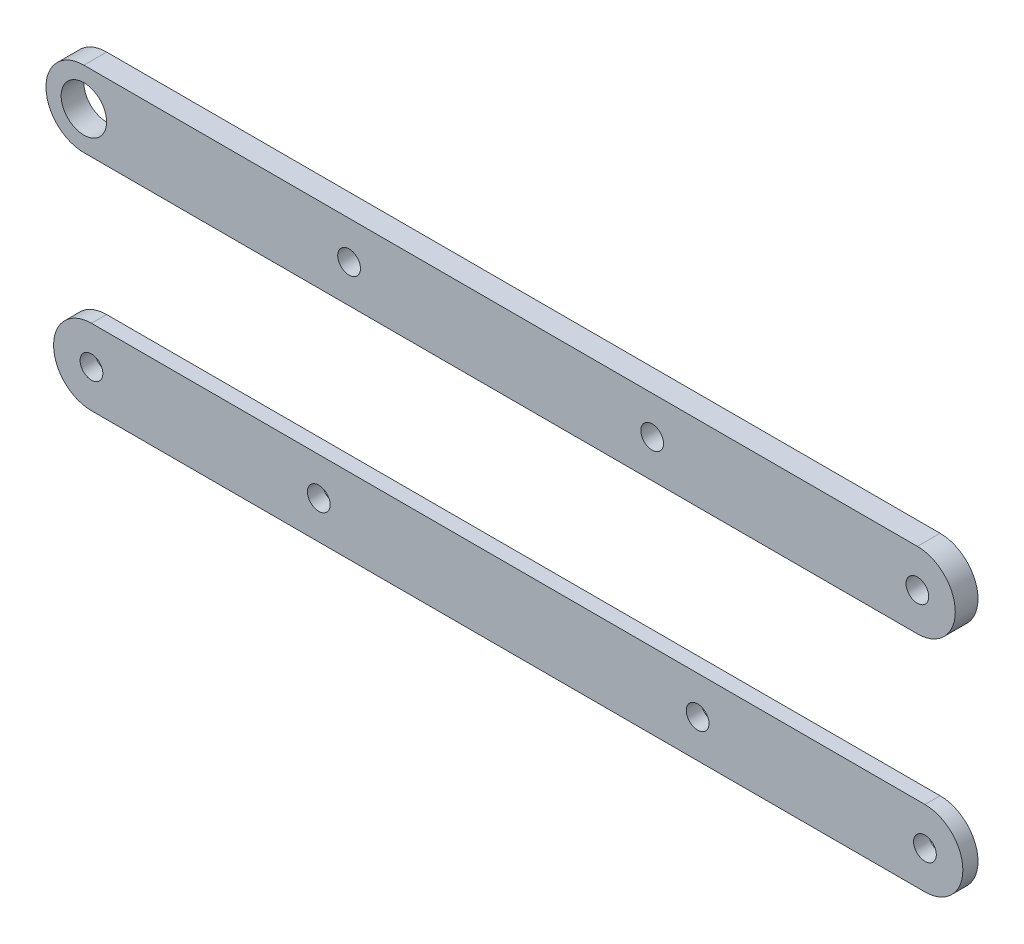
ISO-10303-21;
HEADER;
FILE_DESCRIPTION(('STEP AP214'),'2;1');
FILE_NAME('part.step','',(''),(''),'','','');
FILE_SCHEMA(('AUTOMOTIVE_DESIGN { 1 0 10303 214 1 1 1 1 }'));
ENDSEC;
DATA;
#1=APPLICATION_CONTEXT('core data for automotive mechanical design processes');
#2=APPLICATION_PROTOCOL_DEFINITION('international standard','automotive_design',2000,#1);
#3=PRODUCT_CONTEXT('',#1,'mechanical');
#4=PRODUCT('Part','Part','',(#3));
#5=PRODUCT_RELATED_PRODUCT_CATEGORY('part','',(#4));
#6=PRODUCT_DEFINITION_FORMATION('','',#4);
#7=PRODUCT_DEFINITION_CONTEXT('part definition',#1,'design');
#8=PRODUCT_DEFINITION('design','',#6,#7);
#9=PRODUCT_DEFINITION_SHAPE('','',#8);
#10=(LENGTH_UNIT() NAMED_UNIT(*) SI_UNIT(.MILLI.,.METRE.));
#11=(NAMED_UNIT(*) PLANE_ANGLE_UNIT() SI_UNIT($,.RADIAN.));
#12=(NAMED_UNIT(*) SI_UNIT($,.STERADIAN.) SOLID_ANGLE_UNIT());
#13=UNCERTAINTY_MEASURE_WITH_UNIT(LENGTH_MEASURE(1.E-05),#10,'distance_accuracy_value','');
#14=(GEOMETRIC_REPRESENTATION_CONTEXT(3) GLOBAL_UNCERTAINTY_ASSIGNED_CONTEXT((#13)) GLOBAL_UNIT_ASSIGNED_CONTEXT((#10,
#11,#12)) REPRESENTATION_CONTEXT('',''));
#15=CARTESIAN_POINT('',(0.,0.,0.));
#16=DIRECTION('',(0.,0.,1.));
#17=DIRECTION('',(1.,0.,0.));
#18=AXIS2_PLACEMENT_3D('',#15,#16,#17);
#19=CARTESIAN_POINT('',(-55.,-30.,0.));
#20=DIRECTION('',(0.,0.,1.));
#21=DIRECTION('',(1.,0.,0.));
#22=AXIS2_PLACEMENT_3D('',#19,#20,#21);
#23=CYLINDRICAL_SURFACE('',#22,5.);
#24=CARTESIAN_POINT('',(-55.,-30.,2.));
#25=DIRECTION('',(0.,0.,1.));
#26=DIRECTION('',(1.,0.,0.));
#27=AXIS2_PLACEMENT_3D('',#24,#25,#26);
#28=CIRCLE('',#27,5.);
#29=CARTESIAN_POINT('',(-55.,-25.,2.));
#30=VERTEX_POINT('',#29);
#31=CARTESIAN_POINT('',(-55.,-35.,2.));
#32=VERTEX_POINT('',#31);
#33=EDGE_CURVE('P0_E102',#30,#32,#28,.T.);
#34=ORIENTED_EDGE('',*,*,#33,.F.);
#35=DIRECTION('',(0.,0.,1.));
#36=VECTOR('',#35,1.);
#37=CARTESIAN_POINT('',(-55.,-25.,0.));
#38=LINE('',#37,#36);
#39=CARTESIAN_POINT('',(-55.,-25.,0.));
#40=VERTEX_POINT('',#39);
#41=EDGE_CURVE('P0_E11',#40,#30,#38,.T.);
#42=ORIENTED_EDGE('',*,*,#41,.F.);
#43=CARTESIAN_POINT('',(-55.,-30.,0.));
#44=DIRECTION('',(0.,0.,1.));
#45=DIRECTION('',(1.,0.,0.));
#46=AXIS2_PLACEMENT_3D('',#43,#44,#45);
#47=CIRCLE('',#46,5.);
#48=CARTESIAN_POINT('',(-55.,-35.,0.));
#49=VERTEX_POINT('',#48);
#50=EDGE_CURVE('P0_E95',#40,#49,#47,.T.);
#51=ORIENTED_EDGE('',*,*,#50,.T.);
#52=DIRECTION('',(0.,0.,1.));
#53=VECTOR('',#52,1.);
#54=CARTESIAN_POINT('',(-55.,-35.,0.));
#55=LINE('',#54,#53);
#56=EDGE_CURVE('P0_E40',#49,#32,#55,.T.);
#57=ORIENTED_EDGE('',*,*,#56,.T.);
#58=EDGE_LOOP('',(#34,#42,#51,#57));
#59=FACE_BOUND('',#58,.T.);
#60=ADVANCED_FACE('P0_F37',(#59),#23,.T.);
#61=CARTESIAN_POINT('',(55.,-25.,0.));
#62=DIRECTION('',(0.,1.,0.));
#63=DIRECTION('',(0.,0.,1.));
#64=AXIS2_PLACEMENT_3D('',#61,#62,#63);
#65=PLANE('',#64);
#66=DIRECTION('',(-1.,0.,0.));
#67=VECTOR('',#66,1.);
#68=CARTESIAN_POINT('',(55.,-25.,2.));
#69=LINE('',#68,#67);
#70=CARTESIAN_POINT('',(55.,-25.,2.));
#71=VERTEX_POINT('',#70);
#72=EDGE_CURVE('P0_E97',#71,#30,#69,.T.);
#73=ORIENTED_EDGE('',*,*,#72,.F.);
#74=DIRECTION('',(0.,0.,1.));
#75=VECTOR('',#74,1.);
#76=CARTESIAN_POINT('',(55.,-25.,0.));
#77=LINE('',#76,#75);
#78=CARTESIAN_POINT('',(55.,-25.,0.));
#79=VERTEX_POINT('',#78);
#80=EDGE_CURVE('P0_E46',#79,#71,#77,.T.);
#81=ORIENTED_EDGE('',*,*,#80,.F.);
#82=DIRECTION('',(-1.,0.,0.));
#83=VECTOR('',#82,1.);
#84=CARTESIAN_POINT('',(55.,-25.,0.));
#85=LINE('',#84,#83);
#86=EDGE_CURVE('P0_E92',#79,#40,#85,.T.);
#87=ORIENTED_EDGE('',*,*,#86,.T.);
#88=ORIENTED_EDGE('',*,*,#41,.T.);
#89=EDGE_LOOP('',(#73,#81,#87,#88));
#90=FACE_BOUND('',#89,.T.);
#91=ADVANCED_FACE('P0_F113',(#90),#65,.T.);
#92=CARTESIAN_POINT('',(55.,-30.,0.));
#93=DIRECTION('',(0.,0.,1.));
#94=DIRECTION('',(1.,0.,0.));
#95=AXIS2_PLACEMENT_3D('',#92,#93,#94);
#96=CYLINDRICAL_SURFACE('',#95,5.);
#97=CARTESIAN_POINT('',(55.,-30.,2.));
#98=DIRECTION('',(0.,0.,1.));
#99=DIRECTION('',(1.,0.,0.));
#100=AXIS2_PLACEMENT_3D('',#97,#98,#99);
#101=CIRCLE('',#100,5.);
#102=CARTESIAN_POINT('',(55.,-35.,2.));
#103=VERTEX_POINT('',#102);
#104=EDGE_CURVE('P0_E87',#103,#71,#101,.T.);
#105=ORIENTED_EDGE('',*,*,#104,.F.);
#106=DIRECTION('',(0.,0.,1.));
#107=VECTOR('',#106,1.);
#108=CARTESIAN_POINT('',(55.,-35.,0.));
#109=LINE('',#108,#107);
#110=CARTESIAN_POINT('',(55.,-35.,0.));
#111=VERTEX_POINT('',#110);
#112=EDGE_CURVE('P0_E82',#111,#103,#109,.T.);
#113=ORIENTED_EDGE('',*,*,#112,.F.);
#114=CARTESIAN_POINT('',(55.,-30.,0.));
#115=DIRECTION('',(0.,0.,1.));
#116=DIRECTION('',(1.,0.,0.));
#117=AXIS2_PLACEMENT_3D('',#114,#115,#116);
#118=CIRCLE('',#117,5.);
#119=EDGE_CURVE('P0_E85',#111,#79,#118,.T.);
#120=ORIENTED_EDGE('',*,*,#119,.T.);
#121=ORIENTED_EDGE('',*,*,#80,.T.);
#122=EDGE_LOOP('',(#105,#113,#120,#121));
#123=FACE_BOUND('',#122,.T.);
#124=ADVANCED_FACE('P0_F84',(#123),#96,.T.);
#125=CARTESIAN_POINT('',(-55.,-35.,0.));
#126=DIRECTION('',(0.,-1.,0.));
#127=DIRECTION('',(0.,0.,-1.));
#128=AXIS2_PLACEMENT_3D('',#125,#126,#127);
#129=PLANE('',#128);
#130=DIRECTION('',(1.,0.,0.));
#131=VECTOR('',#130,1.);
#132=CARTESIAN_POINT('',(-55.,-35.,2.));
#133=LINE('',#132,#131);
#134=EDGE_CURVE('P0_E105',#32,#103,#133,.T.);
#135=ORIENTED_EDGE('',*,*,#134,.F.);
#136=ORIENTED_EDGE('',*,*,#56,.F.);
#137=DIRECTION('',(1.,0.,0.));
#138=VECTOR('',#137,1.);
#139=CARTESIAN_POINT('',(-55.,-35.,0.));
#140=LINE('',#139,#138);
#141=EDGE_CURVE('P0_E91',#49,#111,#140,.T.);
#142=ORIENTED_EDGE('',*,*,#141,.T.);
#143=ORIENTED_EDGE('',*,*,#112,.T.);
#144=EDGE_LOOP('',(#135,#136,#142,#143));
#145=FACE_BOUND('',#144,.T.);
#146=ADVANCED_FACE('P0_F94',(#145),#129,.T.);
#147=CARTESIAN_POINT('',(-55.,-30.,0.));
#148=DIRECTION('',(0.,0.,1.));
#149=DIRECTION('',(1.,0.,0.));
#150=AXIS2_PLACEMENT_3D('',#147,#148,#149);
#151=PLANE('',#150);
#152=CARTESIAN_POINT('',(55.,-30.,0.));
#153=DIRECTION('',(0.,0.,1.));
#154=DIRECTION('',(-1.,0.,0.));
#155=AXIS2_PLACEMENT_3D('',#152,#153,#154);
#156=CIRCLE('',#155,1.5);
#157=CARTESIAN_POINT('',(53.5,-30.,0.));
#158=VERTEX_POINT('',#157);
#159=EDGE_CURVE('P0_E154',#158,#158,#156,.T.);
#160=ORIENTED_EDGE('',*,*,#159,.T.);
#161=EDGE_LOOP('',(#160));
#162=FACE_BOUND('',#161,.T.);
#163=CARTESIAN_POINT('',(25.,-30.,0.));
#164=DIRECTION('',(0.,0.,1.));
#165=DIRECTION('',(-1.,0.,0.));
#166=AXIS2_PLACEMENT_3D('',#163,#164,#165);
#167=CIRCLE('',#166,1.5);
#168=CARTESIAN_POINT('',(23.5,-30.,0.));
#169=VERTEX_POINT('',#168);
#170=EDGE_CURVE('P0_E162',#169,#169,#167,.T.);
#171=ORIENTED_EDGE('',*,*,#170,.T.);
#172=EDGE_LOOP('',(#171));
#173=FACE_BOUND('',#172,.T.);
#174=CARTESIAN_POINT('',(-25.,-30.,0.));
#175=DIRECTION('',(0.,0.,1.));
#176=DIRECTION('',(-1.,0.,0.));
#177=AXIS2_PLACEMENT_3D('',#174,#175,#176);
#178=CIRCLE('',#177,1.5);
#179=CARTESIAN_POINT('',(-26.5,-30.,0.));
#180=VERTEX_POINT('',#179);
#181=EDGE_CURVE('P0_E168',#180,#180,#178,.T.);
#182=ORIENTED_EDGE('',*,*,#181,.T.);
#183=EDGE_LOOP('',(#182));
#184=FACE_BOUND('',#183,.T.);
#185=CARTESIAN_POINT('',(-55.,-30.,0.));
#186=DIRECTION('',(0.,0.,1.));
#187=DIRECTION('',(-1.,0.,0.));
#188=AXIS2_PLACEMENT_3D('',#185,#186,#187);
#189=CIRCLE('',#188,1.5);
#190=CARTESIAN_POINT('',(-56.5,-30.,0.));
#191=VERTEX_POINT('',#190);
#192=EDGE_CURVE('P0_E106',#191,#191,#189,.T.);
#193=ORIENTED_EDGE('',*,*,#192,.T.);
#194=EDGE_LOOP('',(#193));
#195=FACE_BOUND('',#194,.T.);
#196=ORIENTED_EDGE('',*,*,#50,.F.);
#197=ORIENTED_EDGE('',*,*,#86,.F.);
#198=ORIENTED_EDGE('',*,*,#119,.F.);
#199=ORIENTED_EDGE('',*,*,#141,.F.);
#200=EDGE_LOOP('',(#196,#197,#198,#199));
#201=FACE_BOUND('',#200,.T.);
#202=ADVANCED_FACE('P0_F90',(#162,#173,#184,#195,#201),#151,.F.);
#203=CARTESIAN_POINT('',(-55.,-30.,2.));
#204=DIRECTION('',(0.,0.,1.));
#205=DIRECTION('',(1.,0.,0.));
#206=AXIS2_PLACEMENT_3D('',#203,#204,#205);
#207=PLANE('',#206);
#208=CARTESIAN_POINT('',(55.,-30.,2.));
#209=DIRECTION('',(0.,0.,1.));
#210=DIRECTION('',(-1.,0.,0.));
#211=AXIS2_PLACEMENT_3D('',#208,#209,#210);
#212=CIRCLE('',#211,1.5);
#213=CARTESIAN_POINT('',(53.5,-30.,2.));
#214=VERTEX_POINT('',#213);
#215=EDGE_CURVE('P0_E157',#214,#214,#212,.T.);
#216=ORIENTED_EDGE('',*,*,#215,.F.);
#217=EDGE_LOOP('',(#216));
#218=FACE_BOUND('',#217,.T.);
#219=CARTESIAN_POINT('',(25.,-30.,2.));
#220=DIRECTION('',(0.,0.,1.));
#221=DIRECTION('',(-1.,0.,0.));
#222=AXIS2_PLACEMENT_3D('',#219,#220,#221);
#223=CIRCLE('',#222,1.5);
#224=CARTESIAN_POINT('',(23.5,-30.,2.));
#225=VERTEX_POINT('',#224);
#226=EDGE_CURVE('P0_E159',#225,#225,#223,.T.);
#227=ORIENTED_EDGE('',*,*,#226,.F.);
#228=EDGE_LOOP('',(#227));
#229=FACE_BOUND('',#228,.T.);
#230=CARTESIAN_POINT('',(-25.,-30.,2.));
#231=DIRECTION('',(0.,0.,1.));
#232=DIRECTION('',(-1.,0.,0.));
#233=AXIS2_PLACEMENT_3D('',#230,#231,#232);
#234=CIRCLE('',#233,1.5);
#235=CARTESIAN_POINT('',(-26.5,-30.,2.));
#236=VERTEX_POINT('',#235);
#237=EDGE_CURVE('P0_E165',#236,#236,#234,.T.);
#238=ORIENTED_EDGE('',*,*,#237,.F.);
#239=EDGE_LOOP('',(#238));
#240=FACE_BOUND('',#239,.T.);
#241=CARTESIAN_POINT('',(-55.,-30.,2.));
#242=DIRECTION('',(0.,0.,1.));
#243=DIRECTION('',(-1.,0.,0.));
#244=AXIS2_PLACEMENT_3D('',#241,#242,#243);
#245=CIRCLE('',#244,1.5);
#246=CARTESIAN_POINT('',(-56.5,-30.,2.));
#247=VERTEX_POINT('',#246);
#248=EDGE_CURVE('P0_E171',#247,#247,#245,.T.);
#249=ORIENTED_EDGE('',*,*,#248,.F.);
#250=EDGE_LOOP('',(#249));
#251=FACE_BOUND('',#250,.T.);
#252=ORIENTED_EDGE('',*,*,#33,.T.);
#253=ORIENTED_EDGE('',*,*,#134,.T.);
#254=ORIENTED_EDGE('',*,*,#104,.T.);
#255=ORIENTED_EDGE('',*,*,#72,.T.);
#256=EDGE_LOOP('',(#252,#253,#254,#255));
#257=FACE_BOUND('',#256,.T.);
#258=ADVANCED_FACE('P0_F112',(#218,#229,#240,#251,#257),#207,.T.);
#259=CARTESIAN_POINT('',(-55.,-30.,0.));
#260=DIRECTION('',(0.,0.,1.));
#261=DIRECTION('',(1.,0.,0.));
#262=AXIS2_PLACEMENT_3D('',#259,#260,#261);
#263=CYLINDRICAL_SURFACE('',#262,1.5);
#264=ORIENTED_EDGE('',*,*,#192,.F.);
#265=EDGE_LOOP('',(#264));
#266=FACE_BOUND('',#265,.T.);
#267=ORIENTED_EDGE('',*,*,#248,.T.);
#268=EDGE_LOOP('',(#267));
#269=FACE_BOUND('',#268,.T.);
#270=ADVANCED_FACE('P0_F131',(#266,#269),#263,.F.);
#271=CARTESIAN_POINT('',(-25.,-30.,0.));
#272=DIRECTION('',(0.,0.,1.));
#273=DIRECTION('',(1.,0.,0.));
#274=AXIS2_PLACEMENT_3D('',#271,#272,#273);
#275=CYLINDRICAL_SURFACE('',#274,1.5);
#276=ORIENTED_EDGE('',*,*,#181,.F.);
#277=EDGE_LOOP('',(#276));
#278=FACE_BOUND('',#277,.T.);
#279=ORIENTED_EDGE('',*,*,#237,.T.);
#280=EDGE_LOOP('',(#279));
#281=FACE_BOUND('',#280,.T.);
#282=ADVANCED_FACE('P0_F138',(#278,#281),#275,.F.);
#283=CARTESIAN_POINT('',(25.,-30.,0.));
#284=DIRECTION('',(0.,0.,1.));
#285=DIRECTION('',(1.,0.,0.));
#286=AXIS2_PLACEMENT_3D('',#283,#284,#285);
#287=CYLINDRICAL_SURFACE('',#286,1.5);
#288=ORIENTED_EDGE('',*,*,#170,.F.);
#289=EDGE_LOOP('',(#288));
#290=FACE_BOUND('',#289,.T.);
#291=ORIENTED_EDGE('',*,*,#226,.T.);
#292=EDGE_LOOP('',(#291));
#293=FACE_BOUND('',#292,.T.);
#294=ADVANCED_FACE('P0_F142',(#290,#293),#287,.F.);
#295=CARTESIAN_POINT('',(55.,-30.,0.));
#296=DIRECTION('',(0.,0.,1.));
#297=DIRECTION('',(1.,0.,0.));
#298=AXIS2_PLACEMENT_3D('',#295,#296,#297);
#299=CYLINDRICAL_SURFACE('',#298,1.5);
#300=ORIENTED_EDGE('',*,*,#159,.F.);
#301=EDGE_LOOP('',(#300));
#302=FACE_BOUND('',#301,.T.);
#303=ORIENTED_EDGE('',*,*,#215,.T.);
#304=EDGE_LOOP('',(#303));
#305=FACE_BOUND('',#304,.T.);
#306=ADVANCED_FACE('P0_F146',(#302,#305),#299,.F.);
#307=CLOSED_SHELL('',(#60,#91,#124,#146,#202,#258,#270,#282,#294,#306));
#308=MANIFOLD_SOLID_BREP('P0_B2',#307);
#309=CARTESIAN_POINT('',(55.,0.,3.));
#310=DIRECTION('',(0.,0.,-1.));
#311=DIRECTION('',(1.,0.,0.));
#312=AXIS2_PLACEMENT_3D('',#309,#310,#311);
#313=CYLINDRICAL_SURFACE('',#312,1.5);
#314=DIRECTION('',(0.,0.,-1.));
#315=VECTOR('',#314,1.);
#316=CARTESIAN_POINT('',(56.5,0.,3.));
#317=LINE('',#316,#315);
#318=CARTESIAN_POINT('',(56.5,0.,3.));
#319=VERTEX_POINT('',#318);
#320=CARTESIAN_POINT('',(56.5,0.,0.));
#321=VERTEX_POINT('',#320);
#322=EDGE_CURVE('P1_E11',#319,#321,#317,.T.);
#323=ORIENTED_EDGE('',*,*,#322,.F.);
#324=CARTESIAN_POINT('',(55.,0.,3.));
#325=DIRECTION('',(0.,0.,1.));
#326=DIRECTION('',(1.,0.,0.));
#327=AXIS2_PLACEMENT_3D('',#324,#325,#326);
#328=CIRCLE('',#327,1.5);
#329=EDGE_CURVE('P1_E119',#319,#319,#328,.T.);
#330=ORIENTED_EDGE('',*,*,#329,.T.);
#331=ORIENTED_EDGE('',*,*,#322,.T.);
#332=CARTESIAN_POINT('',(55.,0.,0.));
#333=DIRECTION('',(0.,0.,-1.));
#334=DIRECTION('',(1.,0.,0.));
#335=AXIS2_PLACEMENT_3D('',#332,#333,#334);
#336=CIRCLE('',#335,1.5);
#337=EDGE_CURVE('P1_E185',#321,#321,#336,.T.);
#338=ORIENTED_EDGE('',*,*,#337,.T.);
#339=EDGE_LOOP('',(#323,#330,#331,#338));
#340=FACE_BOUND('',#339,.T.);
#341=ADVANCED_FACE('P1_F19',(#340),#313,.F.);
#342=CARTESIAN_POINT('',(20.,0.,0.));
#343=DIRECTION('',(0.,0.,-1.));
#344=DIRECTION('',(1.,0.,0.));
#345=AXIS2_PLACEMENT_3D('',#342,#343,#344);
#346=CYLINDRICAL_SURFACE('',#345,1.5);
#347=DIRECTION('',(0.,0.,1.));
#348=VECTOR('',#347,1.);
#349=CARTESIAN_POINT('',(21.5,0.,0.));
#350=LINE('',#349,#348);
#351=CARTESIAN_POINT('',(21.5,0.,0.));
#352=VERTEX_POINT('',#351);
#353=CARTESIAN_POINT('',(21.5,0.,3.));
#354=VERTEX_POINT('',#353);
#355=EDGE_CURVE('P1_E31',#352,#354,#350,.T.);
#356=ORIENTED_EDGE('',*,*,#355,.T.);
#357=CARTESIAN_POINT('',(20.,0.,3.));
#358=DIRECTION('',(0.,0.,1.));
#359=DIRECTION('',(1.,0.,0.));
#360=AXIS2_PLACEMENT_3D('',#357,#358,#359);
#361=CIRCLE('',#360,1.5);
#362=EDGE_CURVE('P1_E193',#354,#354,#361,.T.);
#363=ORIENTED_EDGE('',*,*,#362,.T.);
#364=ORIENTED_EDGE('',*,*,#355,.F.);
#365=CARTESIAN_POINT('',(20.,0.,0.));
#366=DIRECTION('',(0.,0.,1.));
#367=DIRECTION('',(1.,0.,0.));
#368=AXIS2_PLACEMENT_3D('',#365,#366,#367);
#369=CIRCLE('',#368,1.5);
#370=EDGE_CURVE('P1_E139',#352,#352,#369,.T.);
#371=ORIENTED_EDGE('',*,*,#370,.F.);
#372=EDGE_LOOP('',(#356,#363,#364,#371));
#373=FACE_BOUND('',#372,.T.);
#374=ADVANCED_FACE('P1_F373',(#373),#346,.F.);
#375=CARTESIAN_POINT('',(-20.,0.,0.));
#376=DIRECTION('',(0.,0.,-1.));
#377=DIRECTION('',(1.,0.,0.));
#378=AXIS2_PLACEMENT_3D('',#375,#376,#377);
#379=CYLINDRICAL_SURFACE('',#378,1.5);
#380=DIRECTION('',(0.,0.,1.));
#381=VECTOR('',#380,1.);
#382=CARTESIAN_POINT('',(-18.5,0.,0.));
#383=LINE('',#382,#381);
#384=CARTESIAN_POINT('',(-18.5,0.,0.));
#385=VERTEX_POINT('',#384);
#386=CARTESIAN_POINT('',(-18.5,0.,3.));
#387=VERTEX_POINT('',#386);
#388=EDGE_CURVE('P1_E106',#385,#387,#383,.T.);
#389=ORIENTED_EDGE('',*,*,#388,.T.);
#390=CARTESIAN_POINT('',(-20.,0.,3.));
#391=DIRECTION('',(0.,0.,1.));
#392=DIRECTION('',(1.,0.,0.));
#393=AXIS2_PLACEMENT_3D('',#390,#391,#392);
#394=CIRCLE('',#393,1.5);
#395=EDGE_CURVE('P1_E109',#387,#387,#394,.T.);
#396=ORIENTED_EDGE('',*,*,#395,.T.);
#397=ORIENTED_EDGE('',*,*,#388,.F.);
#398=CARTESIAN_POINT('',(-20.,0.,0.));
#399=DIRECTION('',(0.,0.,1.));
#400=DIRECTION('',(1.,0.,0.));
#401=AXIS2_PLACEMENT_3D('',#398,#399,#400);
#402=CIRCLE('',#401,1.5);
#403=EDGE_CURVE('P1_E111',#385,#385,#402,.T.);
#404=ORIENTED_EDGE('',*,*,#403,.F.);
#405=EDGE_LOOP('',(#389,#396,#397,#404));
#406=FACE_BOUND('',#405,.T.);
#407=ADVANCED_FACE('P1_F107',(#406),#379,.F.);
#408=CARTESIAN_POINT('',(-55.,0.,3.));
#409=DIRECTION('',(0.,0.,-1.));
#410=DIRECTION('',(1.,0.,0.));
#411=AXIS2_PLACEMENT_3D('',#408,#409,#410);
#412=CYLINDRICAL_SURFACE('',#411,3.);
#413=DIRECTION('',(0.,0.,-1.));
#414=VECTOR('',#413,1.);
#415=CARTESIAN_POINT('',(-52.,0.,3.));
#416=LINE('',#415,#414);
#417=CARTESIAN_POINT('',(-52.,0.,3.));
#418=VERTEX_POINT('',#417);
#419=CARTESIAN_POINT('',(-52.,0.,0.));
#420=VERTEX_POINT('',#419);
#421=EDGE_CURVE('P1_E98',#418,#420,#416,.T.);
#422=ORIENTED_EDGE('',*,*,#421,.F.);
#423=CARTESIAN_POINT('',(-55.,0.,3.));
#424=DIRECTION('',(0.,0.,1.));
#425=DIRECTION('',(1.,0.,0.));
#426=AXIS2_PLACEMENT_3D('',#423,#424,#425);
#427=CIRCLE('',#426,3.);
#428=EDGE_CURVE('P1_E152',#418,#418,#427,.T.);
#429=ORIENTED_EDGE('',*,*,#428,.T.);
#430=ORIENTED_EDGE('',*,*,#421,.T.);
#431=CARTESIAN_POINT('',(-55.,0.,0.));
#432=DIRECTION('',(0.,0.,-1.));
#433=DIRECTION('',(1.,0.,0.));
#434=AXIS2_PLACEMENT_3D('',#431,#432,#433);
#435=CIRCLE('',#434,3.);
#436=EDGE_CURVE('P1_E140',#420,#420,#435,.T.);
#437=ORIENTED_EDGE('',*,*,#436,.T.);
#438=EDGE_LOOP('',(#422,#429,#430,#437));
#439=FACE_BOUND('',#438,.T.);
#440=ADVANCED_FACE('P1_F358',(#439),#412,.F.);
#441=CARTESIAN_POINT('',(-55.,0.,0.));
#442=DIRECTION('',(0.,0.,-1.));
#443=DIRECTION('',(1.,0.,0.));
#444=AXIS2_PLACEMENT_3D('',#441,#442,#443);
#445=CYLINDRICAL_SURFACE('',#444,5.);
#446=CARTESIAN_POINT('',(-55.,0.,0.));
#447=DIRECTION('',(0.,0.,1.));
#448=DIRECTION('',(1.,0.,0.));
#449=AXIS2_PLACEMENT_3D('',#446,#447,#448);
#450=CIRCLE('',#449,5.);
#451=CARTESIAN_POINT('',(-55.,5.,0.));
#452=VERTEX_POINT('',#451);
#453=CARTESIAN_POINT('',(-55.,-5.,0.));
#454=VERTEX_POINT('',#453);
#455=EDGE_CURVE('P1_E23',#452,#454,#450,.T.);
#456=ORIENTED_EDGE('',*,*,#455,.T.);
#457=DIRECTION('',(0.,0.,1.));
#458=VECTOR('',#457,1.);
#459=CARTESIAN_POINT('',(-55.,-5.,0.));
#460=LINE('',#459,#458);
#461=CARTESIAN_POINT('',(-55.,-5.,3.));
#462=VERTEX_POINT('',#461);
#463=EDGE_CURVE('P1_E141',#454,#462,#460,.T.);
#464=ORIENTED_EDGE('',*,*,#463,.T.);
#465=CARTESIAN_POINT('',(-55.,0.,3.));
#466=DIRECTION('',(0.,0.,1.));
#467=DIRECTION('',(1.,0.,0.));
#468=AXIS2_PLACEMENT_3D('',#465,#466,#467);
#469=CIRCLE('',#468,5.);
#470=CARTESIAN_POINT('',(-55.,5.,3.));
#471=VERTEX_POINT('',#470);
#472=EDGE_CURVE('P1_E156',#471,#462,#469,.T.);
#473=ORIENTED_EDGE('',*,*,#472,.F.);
#474=DIRECTION('',(0.,0.,1.));
#475=VECTOR('',#474,1.);
#476=CARTESIAN_POINT('',(-55.,5.,0.));
#477=LINE('',#476,#475);
#478=EDGE_CURVE('P1_E169',#452,#471,#477,.T.);
#479=ORIENTED_EDGE('',*,*,#478,.F.);
#480=EDGE_LOOP('',(#456,#464,#473,#479));
#481=FACE_BOUND('',#480,.T.);
#482=ADVANCED_FACE('P1_F21',(#481),#445,.T.);
#483=CARTESIAN_POINT('',(0.,0.,3.));
#484=DIRECTION('',(0.,0.,1.));
#485=DIRECTION('',(1.,0.,0.));
#486=AXIS2_PLACEMENT_3D('',#483,#484,#485);
#487=PLANE('',#486);
#488=ORIENTED_EDGE('',*,*,#329,.F.);
#489=EDGE_LOOP('',(#488));
#490=FACE_BOUND('',#489,.T.);
#491=ORIENTED_EDGE('',*,*,#362,.F.);
#492=EDGE_LOOP('',(#491));
#493=FACE_BOUND('',#492,.T.);
#494=ORIENTED_EDGE('',*,*,#395,.F.);
#495=EDGE_LOOP('',(#494));
#496=FACE_BOUND('',#495,.T.);
#497=ORIENTED_EDGE('',*,*,#428,.F.);
#498=EDGE_LOOP('',(#497));
#499=FACE_BOUND('',#498,.T.);
#500=CARTESIAN_POINT('',(55.,0.,3.));
#501=DIRECTION('',(0.,0.,1.));
#502=DIRECTION('',(1.,0.,0.));
#503=AXIS2_PLACEMENT_3D('',#500,#501,#502);
#504=CIRCLE('',#503,5.);
#505=CARTESIAN_POINT('',(55.,-5.,3.));
#506=VERTEX_POINT('',#505);
#507=CARTESIAN_POINT('',(55.,5.,3.));
#508=VERTEX_POINT('',#507);
#509=EDGE_CURVE('P1_E186',#506,#508,#504,.T.);
#510=ORIENTED_EDGE('',*,*,#509,.T.);
#511=DIRECTION('',(1.,0.,0.));
#512=VECTOR('',#511,1.);
#513=CARTESIAN_POINT('',(-55.,5.,3.));
#514=LINE('',#513,#512);
#515=EDGE_CURVE('P1_E173',#471,#508,#514,.T.);
#516=ORIENTED_EDGE('',*,*,#515,.F.);
#517=ORIENTED_EDGE('',*,*,#472,.T.);
#518=DIRECTION('',(1.,0.,0.));
#519=VECTOR('',#518,1.);
#520=CARTESIAN_POINT('',(-55.,-5.,3.));
#521=LINE('',#520,#519);
#522=EDGE_CURVE('P1_E167',#462,#506,#521,.T.);
#523=ORIENTED_EDGE('',*,*,#522,.T.);
#524=EDGE_LOOP('',(#510,#516,#517,#523));
#525=FACE_BOUND('',#524,.T.);
#526=ADVANCED_FACE('P1_F210',(#490,#493,#496,#499,#525),#487,.T.);
#527=CARTESIAN_POINT('',(0.,0.,0.));
#528=DIRECTION('',(0.,0.,1.));
#529=DIRECTION('',(1.,0.,0.));
#530=AXIS2_PLACEMENT_3D('',#527,#528,#529);
#531=PLANE('',#530);
#532=ORIENTED_EDGE('',*,*,#337,.F.);
#533=EDGE_LOOP('',(#532));
#534=FACE_BOUND('',#533,.T.);
#535=ORIENTED_EDGE('',*,*,#370,.T.);
#536=EDGE_LOOP('',(#535));
#537=FACE_BOUND('',#536,.T.);
#538=ORIENTED_EDGE('',*,*,#403,.T.);
#539=EDGE_LOOP('',(#538));
#540=FACE_BOUND('',#539,.T.);
#541=ORIENTED_EDGE('',*,*,#436,.F.);
#542=EDGE_LOOP('',(#541));
#543=FACE_BOUND('',#542,.T.);
#544=DIRECTION('',(1.,0.,0.));
#545=VECTOR('',#544,1.);
#546=CARTESIAN_POINT('',(-55.,-5.,0.));
#547=LINE('',#546,#545);
#548=CARTESIAN_POINT('',(55.,-5.,0.));
#549=VERTEX_POINT('',#548);
#550=EDGE_CURVE('P1_E164',#454,#549,#547,.T.);
#551=ORIENTED_EDGE('',*,*,#550,.F.);
#552=ORIENTED_EDGE('',*,*,#455,.F.);
#553=DIRECTION('',(1.,0.,0.));
#554=VECTOR('',#553,1.);
#555=CARTESIAN_POINT('',(-55.,5.,0.));
#556=LINE('',#555,#554);
#557=CARTESIAN_POINT('',(55.,5.,0.));
#558=VERTEX_POINT('',#557);
#559=EDGE_CURVE('P1_E200',#452,#558,#556,.T.);
#560=ORIENTED_EDGE('',*,*,#559,.T.);
#561=CARTESIAN_POINT('',(55.,0.,0.));
#562=DIRECTION('',(0.,0.,1.));
#563=DIRECTION('',(1.,0.,0.));
#564=AXIS2_PLACEMENT_3D('',#561,#562,#563);
#565=CIRCLE('',#564,5.);
#566=EDGE_CURVE('P1_E174',#549,#558,#565,.T.);
#567=ORIENTED_EDGE('',*,*,#566,.F.);
#568=EDGE_LOOP('',(#551,#552,#560,#567));
#569=FACE_BOUND('',#568,.T.);
#570=ADVANCED_FACE('P1_F327',(#534,#537,#540,#543,#569),#531,.F.);
#571=CARTESIAN_POINT('',(-55.,5.,0.));
#572=DIRECTION('',(0.,1.,0.));
#573=DIRECTION('',(1.,0.,0.));
#574=AXIS2_PLACEMENT_3D('',#571,#572,#573);
#575=PLANE('',#574);
#576=ORIENTED_EDGE('',*,*,#478,.T.);
#577=ORIENTED_EDGE('',*,*,#515,.T.);
#578=DIRECTION('',(0.,0.,1.));
#579=VECTOR('',#578,1.);
#580=CARTESIAN_POINT('',(55.,5.,0.));
#581=LINE('',#580,#579);
#582=EDGE_CURVE('P1_E179',#558,#508,#581,.T.);
#583=ORIENTED_EDGE('',*,*,#582,.F.);
#584=ORIENTED_EDGE('',*,*,#559,.F.);
#585=EDGE_LOOP('',(#576,#577,#583,#584));
#586=FACE_BOUND('',#585,.T.);
#587=ADVANCED_FACE('P1_F231',(#586),#575,.T.);
#588=CARTESIAN_POINT('',(-55.,-5.,0.));
#589=DIRECTION('',(0.,1.,0.));
#590=DIRECTION('',(1.,0.,0.));
#591=AXIS2_PLACEMENT_3D('',#588,#589,#590);
#592=PLANE('',#591);
#593=ORIENTED_EDGE('',*,*,#550,.T.);
#594=DIRECTION('',(0.,0.,1.));
#595=VECTOR('',#594,1.);
#596=CARTESIAN_POINT('',(55.,-5.,0.));
#597=LINE('',#596,#595);
#598=EDGE_CURVE('P1_E168',#549,#506,#597,.T.);
#599=ORIENTED_EDGE('',*,*,#598,.T.);
#600=ORIENTED_EDGE('',*,*,#522,.F.);
#601=ORIENTED_EDGE('',*,*,#463,.F.);
#602=EDGE_LOOP('',(#593,#599,#600,#601));
#603=FACE_BOUND('',#602,.T.);
#604=ADVANCED_FACE('P1_F219',(#603),#592,.F.);
#605=CARTESIAN_POINT('',(55.,0.,0.));
#606=DIRECTION('',(0.,0.,-1.));
#607=DIRECTION('',(1.,0.,0.));
#608=AXIS2_PLACEMENT_3D('',#605,#606,#607);
#609=CYLINDRICAL_SURFACE('',#608,5.);
#610=ORIENTED_EDGE('',*,*,#566,.T.);
#611=ORIENTED_EDGE('',*,*,#582,.T.);
#612=ORIENTED_EDGE('',*,*,#509,.F.);
#613=ORIENTED_EDGE('',*,*,#598,.F.);
#614=EDGE_LOOP('',(#610,#611,#612,#613));
#615=FACE_BOUND('',#614,.T.);
#616=ADVANCED_FACE('P1_F226',(#615),#609,.T.);
#617=CLOSED_SHELL('',(#341,#374,#407,#440,#482,#526,#570,#587,#604,#616));
#618=MANIFOLD_SOLID_BREP('P1_B1',#617);
#619=ADVANCED_BREP_SHAPE_REPRESENTATION('',(#18,#308,#618),#14);
#620=SHAPE_DEFINITION_REPRESENTATION(#9,#619);
ENDSEC;
END-ISO-10303-21;
